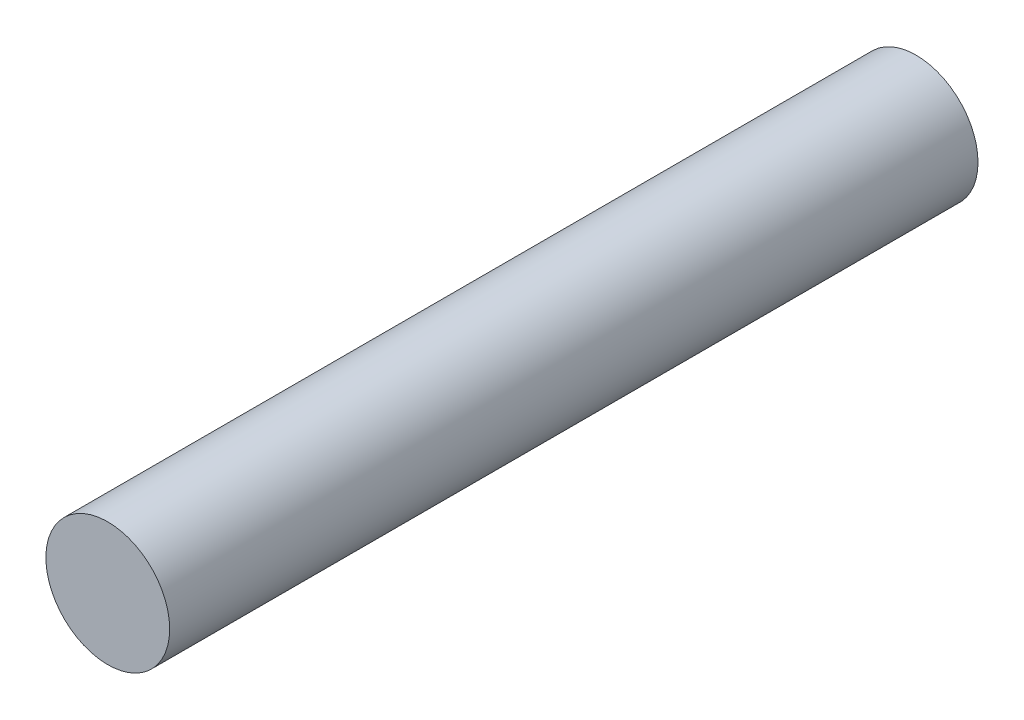
ISO-10303-21;
HEADER;
FILE_DESCRIPTION(('STEP AP214'),'2;1');
FILE_NAME('part.step','',(''),(''),'','','');
FILE_SCHEMA(('AUTOMOTIVE_DESIGN { 1 0 10303 214 1 1 1 1 }'));
ENDSEC;
DATA;
#1=APPLICATION_CONTEXT('core data for automotive mechanical design processes');
#2=APPLICATION_PROTOCOL_DEFINITION('international standard','automotive_design',2000,#1);
#3=PRODUCT_CONTEXT('',#1,'mechanical');
#4=PRODUCT('Part','Part','',(#3));
#5=PRODUCT_RELATED_PRODUCT_CATEGORY('part','',(#4));
#6=PRODUCT_DEFINITION_FORMATION('','',#4);
#7=PRODUCT_DEFINITION_CONTEXT('part definition',#1,'design');
#8=PRODUCT_DEFINITION('design','',#6,#7);
#9=PRODUCT_DEFINITION_SHAPE('','',#8);
#10=(LENGTH_UNIT() NAMED_UNIT(*) SI_UNIT(.MILLI.,.METRE.));
#11=(NAMED_UNIT(*) PLANE_ANGLE_UNIT() SI_UNIT($,.RADIAN.));
#12=(NAMED_UNIT(*) SI_UNIT($,.STERADIAN.) SOLID_ANGLE_UNIT());
#13=UNCERTAINTY_MEASURE_WITH_UNIT(LENGTH_MEASURE(1.E-05),#10,'distance_accuracy_value','');
#14=(GEOMETRIC_REPRESENTATION_CONTEXT(3) GLOBAL_UNCERTAINTY_ASSIGNED_CONTEXT((#13)) GLOBAL_UNIT_ASSIGNED_CONTEXT((#10,
#11,#12)) REPRESENTATION_CONTEXT('',''));
#15=CARTESIAN_POINT('',(0.,0.,0.));
#16=DIRECTION('',(0.,0.,1.));
#17=DIRECTION('',(1.,0.,0.));
#18=AXIS2_PLACEMENT_3D('',#15,#16,#17);
#19=CARTESIAN_POINT('',(0.,0.,140.));
#20=DIRECTION('',(0.,0.,-1.));
#21=DIRECTION('',(-1.,0.,0.));
#22=AXIS2_PLACEMENT_3D('',#19,#20,#21);
#23=CYLINDRICAL_SURFACE('',#22,10.7200241);
#24=CARTESIAN_POINT('',(0.,0.,140.));
#25=DIRECTION('',(0.,0.,1.));
#26=DIRECTION('',(1.,0.,0.));
#27=AXIS2_PLACEMENT_3D('',#24,#25,#26);
#28=CIRCLE('',#27,10.7200241);
#29=CARTESIAN_POINT('',(10.7200241,0.,140.));
#30=VERTEX_POINT('',#29);
#31=EDGE_CURVE('E10',#30,#30,#28,.T.);
#32=ORIENTED_EDGE('',*,*,#31,.F.);
#33=EDGE_LOOP('',(#32));
#34=FACE_BOUND('',#33,.T.);
#35=CARTESIAN_POINT('',(0.,0.,0.));
#36=DIRECTION('',(0.,0.,1.));
#37=DIRECTION('',(1.,0.,0.));
#38=AXIS2_PLACEMENT_3D('',#35,#36,#37);
#39=CIRCLE('',#38,10.7200241);
#40=CARTESIAN_POINT('',(10.7200241,0.,0.));
#41=VERTEX_POINT('',#40);
#42=EDGE_CURVE('E42',#41,#41,#39,.T.);
#43=ORIENTED_EDGE('',*,*,#42,.T.);
#44=EDGE_LOOP('',(#43));
#45=FACE_BOUND('',#44,.T.);
#46=ADVANCED_FACE('F39',(#34,#45),#23,.T.);
#47=CARTESIAN_POINT('',(0.,0.,140.));
#48=DIRECTION('',(0.,0.,1.));
#49=DIRECTION('',(1.,0.,0.));
#50=AXIS2_PLACEMENT_3D('',#47,#48,#49);
#51=PLANE('',#50);
#52=ORIENTED_EDGE('',*,*,#31,.T.);
#53=EDGE_LOOP('',(#52));
#54=FACE_BOUND('',#53,.T.);
#55=ADVANCED_FACE('F56',(#54),#51,.T.);
#56=CARTESIAN_POINT('',(0.,0.,0.));
#57=DIRECTION('',(0.,0.,1.));
#58=DIRECTION('',(1.,0.,0.));
#59=AXIS2_PLACEMENT_3D('',#56,#57,#58);
#60=PLANE('',#59);
#61=ORIENTED_EDGE('',*,*,#42,.F.);
#62=EDGE_LOOP('',(#61));
#63=FACE_BOUND('',#62,.T.);
#64=ADVANCED_FACE('F54',(#63),#60,.F.);
#65=CLOSED_SHELL('',(#46,#55,#64));
#66=MANIFOLD_SOLID_BREP('B2',#65);
#67=ADVANCED_BREP_SHAPE_REPRESENTATION('',(#18,#66),#14);
#68=SHAPE_DEFINITION_REPRESENTATION(#9,#67);
ENDSEC;
END-ISO-10303-21;
